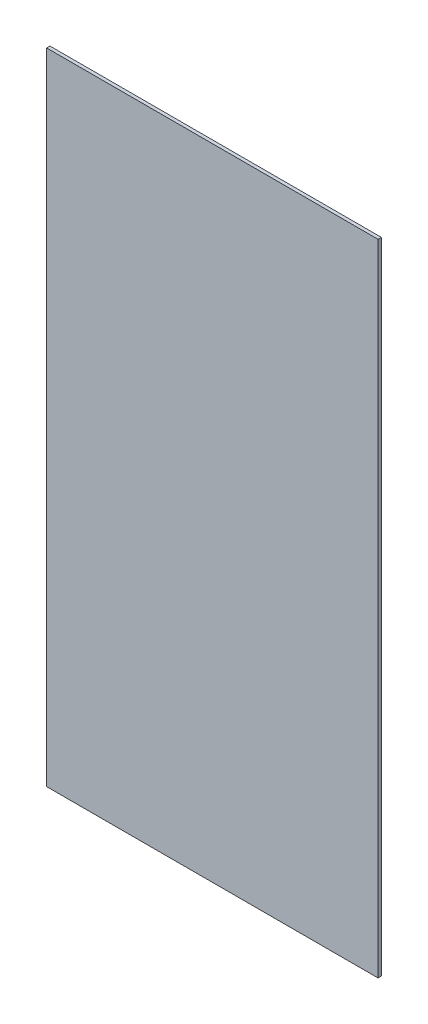
ISO-10303-21;
HEADER;
FILE_DESCRIPTION(('STEP AP214'),'2;1');
FILE_NAME('part.step','',(''),(''),'','','');
FILE_SCHEMA(('AUTOMOTIVE_DESIGN { 1 0 10303 214 1 1 1 1 }'));
ENDSEC;
DATA;
#1=APPLICATION_CONTEXT('core data for automotive mechanical design processes');
#2=APPLICATION_PROTOCOL_DEFINITION('international standard','automotive_design',2000,#1);
#3=PRODUCT_CONTEXT('',#1,'mechanical');
#4=PRODUCT('Part','Part','',(#3));
#5=PRODUCT_RELATED_PRODUCT_CATEGORY('part','',(#4));
#6=PRODUCT_DEFINITION_FORMATION('','',#4);
#7=PRODUCT_DEFINITION_CONTEXT('part definition',#1,'design');
#8=PRODUCT_DEFINITION('design','',#6,#7);
#9=PRODUCT_DEFINITION_SHAPE('','',#8);
#10=(LENGTH_UNIT() NAMED_UNIT(*) SI_UNIT(.MILLI.,.METRE.));
#11=(NAMED_UNIT(*) PLANE_ANGLE_UNIT() SI_UNIT($,.RADIAN.));
#12=(NAMED_UNIT(*) SI_UNIT($,.STERADIAN.) SOLID_ANGLE_UNIT());
#13=UNCERTAINTY_MEASURE_WITH_UNIT(LENGTH_MEASURE(1.E-05),#10,'distance_accuracy_value','');
#14=(GEOMETRIC_REPRESENTATION_CONTEXT(3) GLOBAL_UNCERTAINTY_ASSIGNED_CONTEXT((#13)) GLOBAL_UNIT_ASSIGNED_CONTEXT((#10,
#11,#12)) REPRESENTATION_CONTEXT('',''));
#15=CARTESIAN_POINT('',(0.,0.,0.));
#16=DIRECTION('',(0.,0.,1.));
#17=DIRECTION('',(1.,0.,0.));
#18=AXIS2_PLACEMENT_3D('',#15,#16,#17);
#19=CARTESIAN_POINT('',(-150.,-289.5,1.5));
#20=DIRECTION('',(1.,0.,0.));
#21=DIRECTION('',(0.,0.,-1.));
#22=AXIS2_PLACEMENT_3D('',#19,#20,#21);
#23=PLANE('',#22);
#24=DIRECTION('',(0.,-1.,0.));
#25=VECTOR('',#24,1.);
#26=CARTESIAN_POINT('',(-150.,-289.5,-1.5));
#27=LINE('',#26,#25);
#28=CARTESIAN_POINT('',(-150.,289.5,-1.5));
#29=VERTEX_POINT('',#28);
#30=CARTESIAN_POINT('',(-150.,-289.5,-1.5));
#31=VERTEX_POINT('',#30);
#32=EDGE_CURVE('E96',#29,#31,#27,.T.);
#33=ORIENTED_EDGE('',*,*,#32,.T.);
#34=DIRECTION('',(0.,0.,-1.));
#35=VECTOR('',#34,1.);
#36=CARTESIAN_POINT('',(-150.,-289.5,1.5));
#37=LINE('',#36,#35);
#38=CARTESIAN_POINT('',(-150.,-289.5,1.5));
#39=VERTEX_POINT('',#38);
#40=EDGE_CURVE('E11',#39,#31,#37,.T.);
#41=ORIENTED_EDGE('',*,*,#40,.F.);
#42=DIRECTION('',(0.,-1.,0.));
#43=VECTOR('',#42,1.);
#44=CARTESIAN_POINT('',(-150.,-289.5,1.5));
#45=LINE('',#44,#43);
#46=CARTESIAN_POINT('',(-150.,289.5,1.5));
#47=VERTEX_POINT('',#46);
#48=EDGE_CURVE('E84',#47,#39,#45,.T.);
#49=ORIENTED_EDGE('',*,*,#48,.F.);
#50=DIRECTION('',(0.,0.,-1.));
#51=VECTOR('',#50,1.);
#52=CARTESIAN_POINT('',(-150.,289.5,1.5));
#53=LINE('',#52,#51);
#54=EDGE_CURVE('E92',#47,#29,#53,.T.);
#55=ORIENTED_EDGE('',*,*,#54,.T.);
#56=EDGE_LOOP('',(#33,#41,#49,#55));
#57=FACE_BOUND('',#56,.T.);
#58=ADVANCED_FACE('F33',(#57),#23,.F.);
#59=CARTESIAN_POINT('',(150.,-289.5,1.5));
#60=DIRECTION('',(0.,1.,0.));
#61=DIRECTION('',(-1.,0.,0.));
#62=AXIS2_PLACEMENT_3D('',#59,#60,#61);
#63=PLANE('',#62);
#64=DIRECTION('',(1.,0.,0.));
#65=VECTOR('',#64,1.);
#66=CARTESIAN_POINT('',(150.,-289.5,-1.5));
#67=LINE('',#66,#65);
#68=CARTESIAN_POINT('',(150.,-289.5,-1.5));
#69=VERTEX_POINT('',#68);
#70=EDGE_CURVE('E88',#31,#69,#67,.T.);
#71=ORIENTED_EDGE('',*,*,#70,.T.);
#72=DIRECTION('',(0.,0.,-1.));
#73=VECTOR('',#72,1.);
#74=CARTESIAN_POINT('',(150.,-289.5,1.5));
#75=LINE('',#74,#73);
#76=CARTESIAN_POINT('',(150.,-289.5,1.5));
#77=VERTEX_POINT('',#76);
#78=EDGE_CURVE('E41',#77,#69,#75,.T.);
#79=ORIENTED_EDGE('',*,*,#78,.F.);
#80=DIRECTION('',(1.,0.,0.));
#81=VECTOR('',#80,1.);
#82=CARTESIAN_POINT('',(150.,-289.5,1.5));
#83=LINE('',#82,#81);
#84=EDGE_CURVE('E79',#39,#77,#83,.T.);
#85=ORIENTED_EDGE('',*,*,#84,.F.);
#86=ORIENTED_EDGE('',*,*,#40,.T.);
#87=EDGE_LOOP('',(#71,#79,#85,#86));
#88=FACE_BOUND('',#87,.T.);
#89=ADVANCED_FACE('F87',(#88),#63,.F.);
#90=CARTESIAN_POINT('',(150.,-289.5,1.5));
#91=DIRECTION('',(-1.,0.,0.));
#92=DIRECTION('',(0.,0.,1.));
#93=AXIS2_PLACEMENT_3D('',#90,#91,#92);
#94=PLANE('',#93);
#95=DIRECTION('',(0.,1.,0.));
#96=VECTOR('',#95,1.);
#97=CARTESIAN_POINT('',(150.,-289.5,-1.5));
#98=LINE('',#97,#96);
#99=CARTESIAN_POINT('',(150.,289.5,-1.5));
#100=VERTEX_POINT('',#99);
#101=EDGE_CURVE('E66',#69,#100,#98,.T.);
#102=ORIENTED_EDGE('',*,*,#101,.T.);
#103=DIRECTION('',(0.,0.,-1.));
#104=VECTOR('',#103,1.);
#105=CARTESIAN_POINT('',(150.,289.5,1.5));
#106=LINE('',#105,#104);
#107=CARTESIAN_POINT('',(150.,289.5,1.5));
#108=VERTEX_POINT('',#107);
#109=EDGE_CURVE('E89',#108,#100,#106,.T.);
#110=ORIENTED_EDGE('',*,*,#109,.F.);
#111=DIRECTION('',(0.,1.,0.));
#112=VECTOR('',#111,1.);
#113=CARTESIAN_POINT('',(150.,-289.5,1.5));
#114=LINE('',#113,#112);
#115=EDGE_CURVE('E82',#77,#108,#114,.T.);
#116=ORIENTED_EDGE('',*,*,#115,.F.);
#117=ORIENTED_EDGE('',*,*,#78,.T.);
#118=EDGE_LOOP('',(#102,#110,#116,#117));
#119=FACE_BOUND('',#118,.T.);
#120=ADVANCED_FACE('F90',(#119),#94,.F.);
#121=CARTESIAN_POINT('',(150.,289.5,1.5));
#122=DIRECTION('',(0.,-1.,0.));
#123=DIRECTION('',(1.,0.,0.));
#124=AXIS2_PLACEMENT_3D('',#121,#122,#123);
#125=PLANE('',#124);
#126=DIRECTION('',(-1.,0.,0.));
#127=VECTOR('',#126,1.);
#128=CARTESIAN_POINT('',(150.,289.5,-1.5));
#129=LINE('',#128,#127);
#130=EDGE_CURVE('E72',#100,#29,#129,.T.);
#131=ORIENTED_EDGE('',*,*,#130,.T.);
#132=ORIENTED_EDGE('',*,*,#54,.F.);
#133=DIRECTION('',(-1.,0.,0.));
#134=VECTOR('',#133,1.);
#135=CARTESIAN_POINT('',(150.,289.5,1.5));
#136=LINE('',#135,#134);
#137=EDGE_CURVE('E49',#108,#47,#136,.T.);
#138=ORIENTED_EDGE('',*,*,#137,.F.);
#139=ORIENTED_EDGE('',*,*,#109,.T.);
#140=EDGE_LOOP('',(#131,#132,#138,#139));
#141=FACE_BOUND('',#140,.T.);
#142=ADVANCED_FACE('F103',(#141),#125,.F.);
#143=CARTESIAN_POINT('',(0.,0.,1.5));
#144=DIRECTION('',(0.,0.,1.));
#145=DIRECTION('',(1.,0.,0.));
#146=AXIS2_PLACEMENT_3D('',#143,#144,#145);
#147=PLANE('',#146);
#148=ORIENTED_EDGE('',*,*,#48,.T.);
#149=ORIENTED_EDGE('',*,*,#84,.T.);
#150=ORIENTED_EDGE('',*,*,#115,.T.);
#151=ORIENTED_EDGE('',*,*,#137,.T.);
#152=EDGE_LOOP('',(#148,#149,#150,#151));
#153=FACE_BOUND('',#152,.T.);
#154=ADVANCED_FACE('F80',(#153),#147,.T.);
#155=CARTESIAN_POINT('',(0.,0.,-1.5));
#156=DIRECTION('',(0.,0.,1.));
#157=DIRECTION('',(1.,0.,0.));
#158=AXIS2_PLACEMENT_3D('',#155,#156,#157);
#159=PLANE('',#158);
#160=ORIENTED_EDGE('',*,*,#32,.F.);
#161=ORIENTED_EDGE('',*,*,#130,.F.);
#162=ORIENTED_EDGE('',*,*,#101,.F.);
#163=ORIENTED_EDGE('',*,*,#70,.F.);
#164=EDGE_LOOP('',(#160,#161,#162,#163));
#165=FACE_BOUND('',#164,.T.);
#166=ADVANCED_FACE('F106',(#165),#159,.F.);
#167=CLOSED_SHELL('',(#58,#89,#120,#142,#154,#166));
#168=MANIFOLD_SOLID_BREP('B2',#167);
#169=ADVANCED_BREP_SHAPE_REPRESENTATION('',(#18,#168),#14);
#170=SHAPE_DEFINITION_REPRESENTATION(#9,#169);
ENDSEC;
END-ISO-10303-21;
